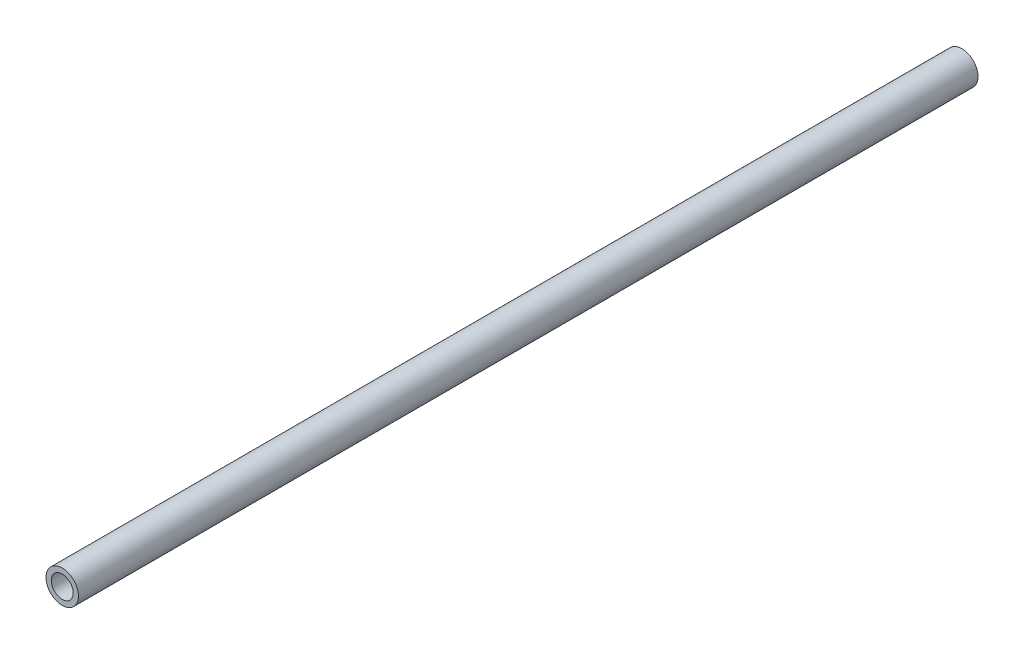
ISO-10303-21;
HEADER;
FILE_DESCRIPTION(('STEP AP214'),'2;1');
FILE_NAME('part.step','',(''),(''),'','','');
FILE_SCHEMA(('AUTOMOTIVE_DESIGN { 1 0 10303 214 1 1 1 1 }'));
ENDSEC;
DATA;
#1=APPLICATION_CONTEXT('core data for automotive mechanical design processes');
#2=APPLICATION_PROTOCOL_DEFINITION('international standard','automotive_design',2000,#1);
#3=PRODUCT_CONTEXT('',#1,'mechanical');
#4=PRODUCT('Part','Part','',(#3));
#5=PRODUCT_RELATED_PRODUCT_CATEGORY('part','',(#4));
#6=PRODUCT_DEFINITION_FORMATION('','',#4);
#7=PRODUCT_DEFINITION_CONTEXT('part definition',#1,'design');
#8=PRODUCT_DEFINITION('design','',#6,#7);
#9=PRODUCT_DEFINITION_SHAPE('','',#8);
#10=(LENGTH_UNIT() NAMED_UNIT(*) SI_UNIT(.MILLI.,.METRE.));
#11=(NAMED_UNIT(*) PLANE_ANGLE_UNIT() SI_UNIT($,.RADIAN.));
#12=(NAMED_UNIT(*) SI_UNIT($,.STERADIAN.) SOLID_ANGLE_UNIT());
#13=UNCERTAINTY_MEASURE_WITH_UNIT(LENGTH_MEASURE(1.E-05),#10,'distance_accuracy_value','');
#14=(GEOMETRIC_REPRESENTATION_CONTEXT(3) GLOBAL_UNCERTAINTY_ASSIGNED_CONTEXT((#13)) GLOBAL_UNIT_ASSIGNED_CONTEXT((#10,
#11,#12)) REPRESENTATION_CONTEXT('',''));
#15=CARTESIAN_POINT('',(0.,0.,0.));
#16=DIRECTION('',(0.,0.,1.));
#17=DIRECTION('',(1.,0.,0.));
#18=AXIS2_PLACEMENT_3D('',#15,#16,#17);
#19=CARTESIAN_POINT('',(29.1955574919574,164.15,609.6));
#20=DIRECTION('',(0.,0.,-1.));
#21=DIRECTION('',(-1.,0.,0.));
#22=AXIS2_PLACEMENT_3D('',#19,#20,#21);
#23=CYLINDRICAL_SURFACE('',#22,7.44399999999999);
#24=CARTESIAN_POINT('',(29.1955574919574,164.15,609.6));
#25=DIRECTION('',(0.,0.,1.));
#26=DIRECTION('',(1.,0.,0.));
#27=AXIS2_PLACEMENT_3D('',#24,#25,#26);
#28=CIRCLE('',#27,7.44399999999999);
#29=CARTESIAN_POINT('',(21.7515574919574,164.15,609.6));
#30=VERTEX_POINT('',#29);
#31=EDGE_CURVE('E46',#30,#30,#28,.T.);
#32=CARTESIAN_POINT('',(29.1955574919574,164.15,0.));
#33=DIRECTION('',(0.,0.,1.));
#34=DIRECTION('',(1.,0.,0.));
#35=AXIS2_PLACEMENT_3D('',#32,#33,#34);
#36=CIRCLE('',#35,7.44399999999999);
#37=CARTESIAN_POINT('',(21.7515574919574,164.15,0.));
#38=VERTEX_POINT('',#37);
#39=EDGE_CURVE('E52',#38,#38,#36,.T.);
#40=CARTESIAN_POINT('',(21.7515574919574,164.15,609.6));
#41=CARTESIAN_POINT('',(21.7515574919574,164.15,603.25));
#42=CARTESIAN_POINT('',(21.7515574919574,164.15,596.9));
#43=CARTESIAN_POINT('',(21.7515574919574,164.15,584.2));
#44=CARTESIAN_POINT('',(21.7515574919574,164.15,577.85));
#45=CARTESIAN_POINT('',(21.7515574919574,164.15,565.15));
#46=CARTESIAN_POINT('',(21.7515574919574,164.15,558.8));
#47=CARTESIAN_POINT('',(21.7515574919574,164.15,546.1));
#48=CARTESIAN_POINT('',(21.7515574919574,164.15,539.75));
#49=CARTESIAN_POINT('',(21.7515574919574,164.15,527.05));
#50=CARTESIAN_POINT('',(21.7515574919574,164.15,520.7));
#51=CARTESIAN_POINT('',(21.7515574919574,164.15,508.));
#52=CARTESIAN_POINT('',(21.7515574919574,164.15,501.65));
#53=CARTESIAN_POINT('',(21.7515574919574,164.15,488.95));
#54=CARTESIAN_POINT('',(21.7515574919574,164.15,482.6));
#55=CARTESIAN_POINT('',(21.7515574919574,164.15,469.9));
#56=CARTESIAN_POINT('',(21.7515574919574,164.15,463.55));
#57=CARTESIAN_POINT('',(21.7515574919574,164.15,450.85));
#58=CARTESIAN_POINT('',(21.7515574919574,164.15,444.5));
#59=CARTESIAN_POINT('',(21.7515574919574,164.15,431.8));
#60=CARTESIAN_POINT('',(21.7515574919574,164.15,425.45));
#61=CARTESIAN_POINT('',(21.7515574919574,164.15,412.75));
#62=CARTESIAN_POINT('',(21.7515574919574,164.15,406.4));
#63=CARTESIAN_POINT('',(21.7515574919574,164.15,393.7));
#64=CARTESIAN_POINT('',(21.7515574919574,164.15,387.35));
#65=CARTESIAN_POINT('',(21.7515574919574,164.15,374.65));
#66=CARTESIAN_POINT('',(21.7515574919574,164.15,368.3));
#67=CARTESIAN_POINT('',(21.7515574919574,164.15,355.6));
#68=CARTESIAN_POINT('',(21.7515574919574,164.15,349.25));
#69=CARTESIAN_POINT('',(21.7515574919574,164.15,336.55));
#70=CARTESIAN_POINT('',(21.7515574919574,164.15,330.2));
#71=CARTESIAN_POINT('',(21.7515574919574,164.15,317.5));
#72=CARTESIAN_POINT('',(21.7515574919574,164.15,311.15));
#73=CARTESIAN_POINT('',(21.7515574919574,164.15,298.45));
#74=CARTESIAN_POINT('',(21.7515574919574,164.15,292.1));
#75=CARTESIAN_POINT('',(21.7515574919574,164.15,279.4));
#76=CARTESIAN_POINT('',(21.7515574919574,164.15,273.05));
#77=CARTESIAN_POINT('',(21.7515574919574,164.15,260.35));
#78=CARTESIAN_POINT('',(21.7515574919574,164.15,254.));
#79=CARTESIAN_POINT('',(21.7515574919574,164.15,241.3));
#80=CARTESIAN_POINT('',(21.7515574919574,164.15,234.95));
#81=CARTESIAN_POINT('',(21.7515574919574,164.15,222.25));
#82=CARTESIAN_POINT('',(21.7515574919574,164.15,215.9));
#83=CARTESIAN_POINT('',(21.7515574919574,164.15,203.2));
#84=CARTESIAN_POINT('',(21.7515574919574,164.15,196.85));
#85=CARTESIAN_POINT('',(21.7515574919574,164.15,184.15));
#86=CARTESIAN_POINT('',(21.7515574919574,164.15,177.8));
#87=CARTESIAN_POINT('',(21.7515574919574,164.15,165.1));
#88=CARTESIAN_POINT('',(21.7515574919574,164.15,158.75));
#89=CARTESIAN_POINT('',(21.7515574919574,164.15,146.05));
#90=CARTESIAN_POINT('',(21.7515574919574,164.15,139.7));
#91=CARTESIAN_POINT('',(21.7515574919574,164.15,127.));
#92=CARTESIAN_POINT('',(21.7515574919574,164.15,120.65));
#93=CARTESIAN_POINT('',(21.7515574919574,164.15,107.95));
#94=CARTESIAN_POINT('',(21.7515574919574,164.15,101.6));
#95=CARTESIAN_POINT('',(21.7515574919574,164.15,88.9));
#96=CARTESIAN_POINT('',(21.7515574919574,164.15,82.5500000000001));
#97=CARTESIAN_POINT('',(21.7515574919574,164.15,69.85));
#98=CARTESIAN_POINT('',(21.7515574919574,164.15,63.5));
#99=CARTESIAN_POINT('',(21.7515574919574,164.15,50.8));
#100=CARTESIAN_POINT('',(21.7515574919574,164.15,44.45));
#101=CARTESIAN_POINT('',(21.7515574919574,164.15,31.75));
#102=CARTESIAN_POINT('',(21.7515574919574,164.15,25.4));
#103=CARTESIAN_POINT('',(21.7515574919574,164.15,12.7));
#104=CARTESIAN_POINT('',(21.7515574919574,164.15,6.35000000000001));
#105=CARTESIAN_POINT('',(21.7515574919574,164.15,0.));
#106=B_SPLINE_CURVE_WITH_KNOTS('',3,(#40,#41,#42,#43,#44,#45,#46,#47,#48,#49,#50,#51,#52,#53,
#54,#55,#56,#57,#58,#59,#60,#61,#62,#63,#64,#65,#66,#67,#68,#69,#70,#71,#72,#73,#74,#75,#76,#77,
#78,#79,#80,#81,#82,#83,#84,#85,#86,#87,#88,#89,#90,#91,#92,#93,#94,#95,#96,#97,#98,#99,#100,
#101,#102,#103,#104,#105),.UNSPECIFIED.,.F.,.F.,(4,2,2,2,2,2,2,2,2,2,2,2,2,2,2,2,2,2,2,2,2,2,2,
2,2,2,2,2,2,2,2,2,4),(0.,19.05,38.1,57.15,76.2,95.2500000000001,114.3,133.35,152.4,171.45,190.5,
209.55,228.6,247.65,266.7,285.75,304.8,323.85,342.9,361.95,381.,400.05,419.1,438.15,457.2,
476.25,495.3,514.35,533.4,552.45,571.5,590.55,609.6),.UNSPECIFIED.);
#107=EDGE_CURVE('BSEAM39',#30,#38,#106,.T.);
#108=ORIENTED_EDGE('',*,*,#31,.T.);
#109=ORIENTED_EDGE('',*,*,#39,.F.);
#110=ORIENTED_EDGE('',*,*,#107,.T.);
#111=ORIENTED_EDGE('',*,*,#107,.F.);
#112=EDGE_LOOP('',(#108,#110,#109,#111));
#113=FACE_BOUND('',#112,.T.);
#114=ADVANCED_FACE('F39',(#113),#23,.F.);
#115=CARTESIAN_POINT('',(29.1955574919574,164.15,609.6));
#116=DIRECTION('',(0.,0.,-1.));
#117=DIRECTION('',(-1.,0.,0.));
#118=AXIS2_PLACEMENT_3D('',#115,#116,#117);
#119=CYLINDRICAL_SURFACE('',#118,11.);
#120=CARTESIAN_POINT('',(29.1955574919574,164.15,609.6));
#121=DIRECTION('',(0.,0.,1.));
#122=DIRECTION('',(1.,0.,0.));
#123=AXIS2_PLACEMENT_3D('',#120,#121,#122);
#124=CIRCLE('',#123,11.);
#125=CARTESIAN_POINT('',(18.1955574919574,164.15,609.6));
#126=VERTEX_POINT('',#125);
#127=EDGE_CURVE('E10',#126,#126,#124,.T.);
#128=CARTESIAN_POINT('',(29.1955574919574,164.15,0.));
#129=DIRECTION('',(0.,0.,1.));
#130=DIRECTION('',(1.,0.,0.));
#131=AXIS2_PLACEMENT_3D('',#128,#129,#130);
#132=CIRCLE('',#131,11.);
#133=CARTESIAN_POINT('',(18.1955574919574,164.15,0.));
#134=VERTEX_POINT('',#133);
#135=EDGE_CURVE('E42',#134,#134,#132,.T.);
#136=CARTESIAN_POINT('',(18.1955574919574,164.15,609.6));
#137=CARTESIAN_POINT('',(18.1955574919574,164.15,603.25));
#138=CARTESIAN_POINT('',(18.1955574919574,164.15,596.9));
#139=CARTESIAN_POINT('',(18.1955574919574,164.15,584.2));
#140=CARTESIAN_POINT('',(18.1955574919574,164.15,577.85));
#141=CARTESIAN_POINT('',(18.1955574919574,164.15,565.15));
#142=CARTESIAN_POINT('',(18.1955574919574,164.15,558.8));
#143=CARTESIAN_POINT('',(18.1955574919574,164.15,546.1));
#144=CARTESIAN_POINT('',(18.1955574919574,164.15,539.75));
#145=CARTESIAN_POINT('',(18.1955574919574,164.15,527.05));
#146=CARTESIAN_POINT('',(18.1955574919574,164.15,520.7));
#147=CARTESIAN_POINT('',(18.1955574919574,164.15,508.));
#148=CARTESIAN_POINT('',(18.1955574919574,164.15,501.65));
#149=CARTESIAN_POINT('',(18.1955574919574,164.15,488.95));
#150=CARTESIAN_POINT('',(18.1955574919574,164.15,482.6));
#151=CARTESIAN_POINT('',(18.1955574919574,164.15,469.9));
#152=CARTESIAN_POINT('',(18.1955574919574,164.15,463.55));
#153=CARTESIAN_POINT('',(18.1955574919574,164.15,450.85));
#154=CARTESIAN_POINT('',(18.1955574919574,164.15,444.5));
#155=CARTESIAN_POINT('',(18.1955574919574,164.15,431.8));
#156=CARTESIAN_POINT('',(18.1955574919574,164.15,425.45));
#157=CARTESIAN_POINT('',(18.1955574919574,164.15,412.75));
#158=CARTESIAN_POINT('',(18.1955574919574,164.15,406.4));
#159=CARTESIAN_POINT('',(18.1955574919574,164.15,393.7));
#160=CARTESIAN_POINT('',(18.1955574919574,164.15,387.35));
#161=CARTESIAN_POINT('',(18.1955574919574,164.15,374.65));
#162=CARTESIAN_POINT('',(18.1955574919574,164.15,368.3));
#163=CARTESIAN_POINT('',(18.1955574919574,164.15,355.6));
#164=CARTESIAN_POINT('',(18.1955574919574,164.15,349.25));
#165=CARTESIAN_POINT('',(18.1955574919574,164.15,336.55));
#166=CARTESIAN_POINT('',(18.1955574919574,164.15,330.2));
#167=CARTESIAN_POINT('',(18.1955574919574,164.15,317.5));
#168=CARTESIAN_POINT('',(18.1955574919574,164.15,311.15));
#169=CARTESIAN_POINT('',(18.1955574919574,164.15,298.45));
#170=CARTESIAN_POINT('',(18.1955574919574,164.15,292.1));
#171=CARTESIAN_POINT('',(18.1955574919574,164.15,279.4));
#172=CARTESIAN_POINT('',(18.1955574919574,164.15,273.05));
#173=CARTESIAN_POINT('',(18.1955574919574,164.15,260.35));
#174=CARTESIAN_POINT('',(18.1955574919574,164.15,254.));
#175=CARTESIAN_POINT('',(18.1955574919574,164.15,241.3));
#176=CARTESIAN_POINT('',(18.1955574919574,164.15,234.95));
#177=CARTESIAN_POINT('',(18.1955574919574,164.15,222.25));
#178=CARTESIAN_POINT('',(18.1955574919574,164.15,215.9));
#179=CARTESIAN_POINT('',(18.1955574919574,164.15,203.2));
#180=CARTESIAN_POINT('',(18.1955574919574,164.15,196.85));
#181=CARTESIAN_POINT('',(18.1955574919574,164.15,184.15));
#182=CARTESIAN_POINT('',(18.1955574919574,164.15,177.8));
#183=CARTESIAN_POINT('',(18.1955574919574,164.15,165.1));
#184=CARTESIAN_POINT('',(18.1955574919574,164.15,158.75));
#185=CARTESIAN_POINT('',(18.1955574919574,164.15,146.05));
#186=CARTESIAN_POINT('',(18.1955574919574,164.15,139.7));
#187=CARTESIAN_POINT('',(18.1955574919574,164.15,127.));
#188=CARTESIAN_POINT('',(18.1955574919574,164.15,120.65));
#189=CARTESIAN_POINT('',(18.1955574919574,164.15,107.95));
#190=CARTESIAN_POINT('',(18.1955574919574,164.15,101.6));
#191=CARTESIAN_POINT('',(18.1955574919574,164.15,88.9));
#192=CARTESIAN_POINT('',(18.1955574919574,164.15,82.5500000000001));
#193=CARTESIAN_POINT('',(18.1955574919574,164.15,69.85));
#194=CARTESIAN_POINT('',(18.1955574919574,164.15,63.5));
#195=CARTESIAN_POINT('',(18.1955574919574,164.15,50.8));
#196=CARTESIAN_POINT('',(18.1955574919574,164.15,44.45));
#197=CARTESIAN_POINT('',(18.1955574919574,164.15,31.75));
#198=CARTESIAN_POINT('',(18.1955574919574,164.15,25.4));
#199=CARTESIAN_POINT('',(18.1955574919574,164.15,12.7));
#200=CARTESIAN_POINT('',(18.1955574919574,164.15,6.35000000000001));
#201=CARTESIAN_POINT('',(18.1955574919574,164.15,0.));
#202=B_SPLINE_CURVE_WITH_KNOTS('',3,(#136,#137,#138,#139,#140,#141,#142,#143,#144,#145,#146,
#147,#148,#149,#150,#151,#152,#153,#154,#155,#156,#157,#158,#159,#160,#161,#162,#163,#164,#165,
#166,#167,#168,#169,#170,#171,#172,#173,#174,#175,#176,#177,#178,#179,#180,#181,#182,#183,#184,
#185,#186,#187,#188,#189,#190,#191,#192,#193,#194,#195,#196,#197,#198,#199,#200,#201),
.UNSPECIFIED.,.F.,.F.,(4,2,2,2,2,2,2,2,2,2,2,2,2,2,2,2,2,2,2,2,2,2,2,2,2,2,2,2,2,2,2,2,4),(0.,
19.05,38.1,57.15,76.2,95.2500000000001,114.3,133.35,152.4,171.45,190.5,209.55,228.6,247.65,
266.7,285.75,304.8,323.85,342.9,361.95,381.,400.05,419.1,438.15,457.2,476.25,495.3,514.35,533.4,
552.45,571.5,590.55,609.6),.UNSPECIFIED.);
#203=EDGE_CURVE('BSEAM59',#126,#134,#202,.T.);
#204=ORIENTED_EDGE('',*,*,#127,.F.);
#205=ORIENTED_EDGE('',*,*,#135,.T.);
#206=ORIENTED_EDGE('',*,*,#203,.T.);
#207=ORIENTED_EDGE('',*,*,#203,.F.);
#208=EDGE_LOOP('',(#204,#206,#205,#207));
#209=FACE_BOUND('',#208,.T.);
#210=ADVANCED_FACE('F59',(#209),#119,.T.);
#211=CARTESIAN_POINT('',(0.,0.,609.6));
#212=DIRECTION('',(0.,0.,1.));
#213=DIRECTION('',(1.,0.,0.));
#214=AXIS2_PLACEMENT_3D('',#211,#212,#213);
#215=PLANE('',#214);
#216=ORIENTED_EDGE('',*,*,#31,.F.);
#217=EDGE_LOOP('',(#216));
#218=FACE_BOUND('',#217,.T.);
#219=ORIENTED_EDGE('',*,*,#127,.T.);
#220=EDGE_LOOP('',(#219));
#221=FACE_BOUND('',#220,.T.);
#222=ADVANCED_FACE('F63',(#218,#221),#215,.T.);
#223=CARTESIAN_POINT('',(0.,0.,0.));
#224=DIRECTION('',(0.,0.,1.));
#225=DIRECTION('',(1.,0.,0.));
#226=AXIS2_PLACEMENT_3D('',#223,#224,#225);
#227=PLANE('',#226);
#228=ORIENTED_EDGE('',*,*,#39,.T.);
#229=EDGE_LOOP('',(#228));
#230=FACE_BOUND('',#229,.T.);
#231=ORIENTED_EDGE('',*,*,#135,.F.);
#232=EDGE_LOOP('',(#231));
#233=FACE_BOUND('',#232,.T.);
#234=ADVANCED_FACE('F61',(#230,#233),#227,.F.);
#235=CLOSED_SHELL('',(#114,#210,#222,#234));
#236=MANIFOLD_SOLID_BREP('B2',#235);
#237=ADVANCED_BREP_SHAPE_REPRESENTATION('',(#18,#236),#14);
#238=SHAPE_DEFINITION_REPRESENTATION(#9,#237);
ENDSEC;
END-ISO-10303-21;
